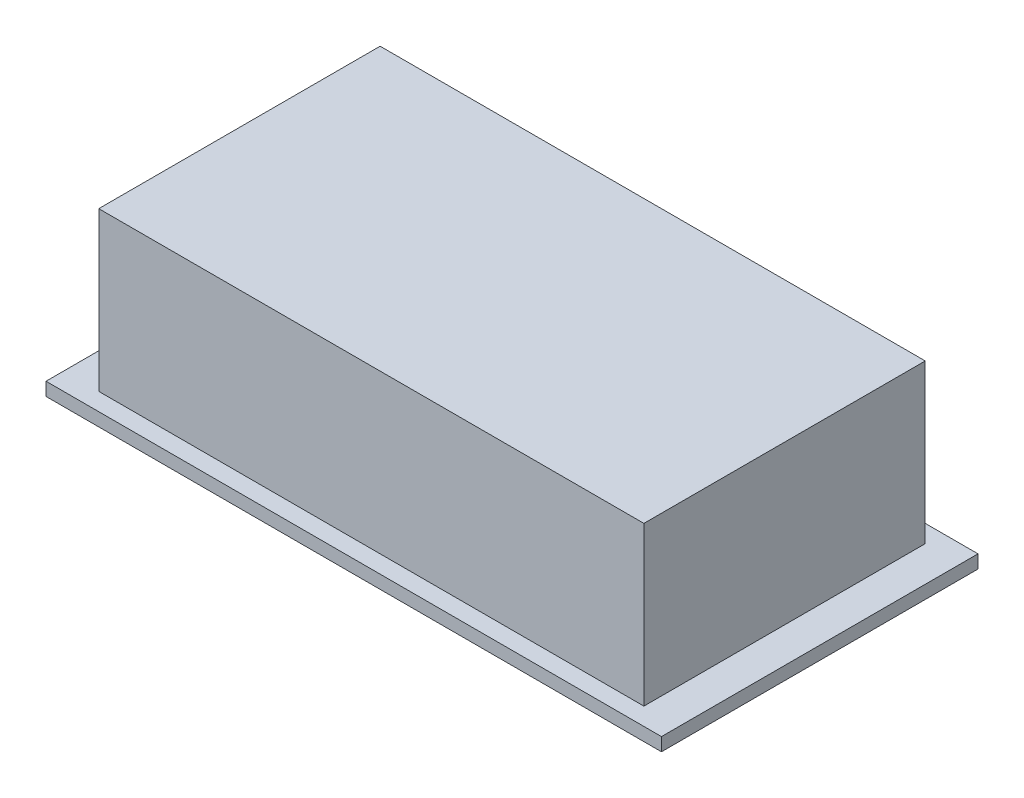
ISO-10303-21;
HEADER;
FILE_DESCRIPTION(('STEP AP214'),'2;1');
FILE_NAME('part.step','',(''),(''),'','','');
FILE_SCHEMA(('AUTOMOTIVE_DESIGN { 1 0 10303 214 1 1 1 1 }'));
ENDSEC;
DATA;
#1=APPLICATION_CONTEXT('core data for automotive mechanical design processes');
#2=APPLICATION_PROTOCOL_DEFINITION('international standard','automotive_design',2000,#1);
#3=PRODUCT_CONTEXT('',#1,'mechanical');
#4=PRODUCT('Part','Part','',(#3));
#5=PRODUCT_RELATED_PRODUCT_CATEGORY('part','',(#4));
#6=PRODUCT_DEFINITION_FORMATION('','',#4);
#7=PRODUCT_DEFINITION_CONTEXT('part definition',#1,'design');
#8=PRODUCT_DEFINITION('design','',#6,#7);
#9=PRODUCT_DEFINITION_SHAPE('','',#8);
#10=(LENGTH_UNIT() NAMED_UNIT(*) SI_UNIT(.MILLI.,.METRE.));
#11=(NAMED_UNIT(*) PLANE_ANGLE_UNIT() SI_UNIT($,.RADIAN.));
#12=(NAMED_UNIT(*) SI_UNIT($,.STERADIAN.) SOLID_ANGLE_UNIT());
#13=UNCERTAINTY_MEASURE_WITH_UNIT(LENGTH_MEASURE(1.E-05),#10,'distance_accuracy_value','');
#14=(GEOMETRIC_REPRESENTATION_CONTEXT(3) GLOBAL_UNCERTAINTY_ASSIGNED_CONTEXT((#13)) GLOBAL_UNIT_ASSIGNED_CONTEXT((#10,
#11,#12)) REPRESENTATION_CONTEXT('',''));
#15=CARTESIAN_POINT('',(0.,0.,0.));
#16=DIRECTION('',(0.,0.,1.));
#17=DIRECTION('',(1.,0.,0.));
#18=AXIS2_PLACEMENT_3D('',#15,#16,#17);
#19=CARTESIAN_POINT('',(0.,1.5,0.));
#20=DIRECTION('',(0.,-1.,0.));
#21=DIRECTION('',(0.,0.,-1.));
#22=AXIS2_PLACEMENT_3D('',#19,#20,#21);
#23=PLANE('',#22);
#24=DIRECTION('',(0.,0.,-1.));
#25=VECTOR('',#24,1.);
#26=CARTESIAN_POINT('',(35.,1.5,18.));
#27=LINE('',#26,#25);
#28=CARTESIAN_POINT('',(35.,1.5,18.));
#29=VERTEX_POINT('',#28);
#30=CARTESIAN_POINT('',(35.,1.5,-18.));
#31=VERTEX_POINT('',#30);
#32=EDGE_CURVE('E143',#29,#31,#27,.T.);
#33=ORIENTED_EDGE('',*,*,#32,.T.);
#34=DIRECTION('',(-1.,0.,0.));
#35=VECTOR('',#34,1.);
#36=CARTESIAN_POINT('',(-35.,1.5,-18.));
#37=LINE('',#36,#35);
#38=CARTESIAN_POINT('',(-35.,1.5,-18.));
#39=VERTEX_POINT('',#38);
#40=EDGE_CURVE('E147',#31,#39,#37,.T.);
#41=ORIENTED_EDGE('',*,*,#40,.T.);
#42=DIRECTION('',(0.,0.,1.));
#43=VECTOR('',#42,1.);
#44=CARTESIAN_POINT('',(-35.,1.5,18.));
#45=LINE('',#44,#43);
#46=CARTESIAN_POINT('',(-35.,1.5,18.));
#47=VERTEX_POINT('',#46);
#48=EDGE_CURVE('E151',#39,#47,#45,.T.);
#49=ORIENTED_EDGE('',*,*,#48,.T.);
#50=DIRECTION('',(1.,0.,0.));
#51=VECTOR('',#50,1.);
#52=CARTESIAN_POINT('',(-35.,1.5,18.));
#53=LINE('',#52,#51);
#54=EDGE_CURVE('E154',#47,#29,#53,.T.);
#55=ORIENTED_EDGE('',*,*,#54,.T.);
#56=EDGE_LOOP('',(#33,#41,#49,#55));
#57=FACE_BOUND('',#56,.T.);
#58=DIRECTION('',(0.,0.,-1.));
#59=VECTOR('',#58,1.);
#60=CARTESIAN_POINT('',(31.,1.5,16.));
#61=LINE('',#60,#59);
#62=CARTESIAN_POINT('',(31.,1.5,16.));
#63=VERTEX_POINT('',#62);
#64=CARTESIAN_POINT('',(31.,1.5,-16.));
#65=VERTEX_POINT('',#64);
#66=EDGE_CURVE('E59',#63,#65,#61,.T.);
#67=ORIENTED_EDGE('',*,*,#66,.F.);
#68=DIRECTION('',(1.,0.,0.));
#69=VECTOR('',#68,1.);
#70=CARTESIAN_POINT('',(-31.,1.5,16.));
#71=LINE('',#70,#69);
#72=CARTESIAN_POINT('',(-31.,1.5,16.));
#73=VERTEX_POINT('',#72);
#74=EDGE_CURVE('E63',#73,#63,#71,.T.);
#75=ORIENTED_EDGE('',*,*,#74,.F.);
#76=DIRECTION('',(0.,0.,1.));
#77=VECTOR('',#76,1.);
#78=CARTESIAN_POINT('',(-31.,1.5,16.));
#79=LINE('',#78,#77);
#80=CARTESIAN_POINT('',(-31.,1.5,-16.));
#81=VERTEX_POINT('',#80);
#82=EDGE_CURVE('E309',#81,#73,#79,.T.);
#83=ORIENTED_EDGE('',*,*,#82,.F.);
#84=DIRECTION('',(-1.,0.,0.));
#85=VECTOR('',#84,1.);
#86=CARTESIAN_POINT('',(-31.,1.5,-16.));
#87=LINE('',#86,#85);
#88=EDGE_CURVE('E319',#65,#81,#87,.T.);
#89=ORIENTED_EDGE('',*,*,#88,.F.);
#90=EDGE_LOOP('',(#67,#75,#83,#89));
#91=FACE_BOUND('',#90,.T.);
#92=ADVANCED_FACE('F43',(#57,#91),#23,.F.);
#93=CARTESIAN_POINT('',(35.,1.5,18.));
#94=DIRECTION('',(-1.,0.,0.));
#95=DIRECTION('',(0.,0.,1.));
#96=AXIS2_PLACEMENT_3D('',#93,#94,#95);
#97=PLANE('',#96);
#98=DIRECTION('',(0.,0.,-1.));
#99=VECTOR('',#98,1.);
#100=CARTESIAN_POINT('',(35.,0.,18.));
#101=LINE('',#100,#99);
#102=CARTESIAN_POINT('',(35.,0.,18.));
#103=VERTEX_POINT('',#102);
#104=CARTESIAN_POINT('',(35.,0.,-18.));
#105=VERTEX_POINT('',#104);
#106=EDGE_CURVE('E132',#103,#105,#101,.T.);
#107=ORIENTED_EDGE('',*,*,#106,.T.);
#108=DIRECTION('',(0.,-1.,0.));
#109=VECTOR('',#108,1.);
#110=CARTESIAN_POINT('',(35.,1.5,-18.));
#111=LINE('',#110,#109);
#112=EDGE_CURVE('E11',#31,#105,#111,.T.);
#113=ORIENTED_EDGE('',*,*,#112,.F.);
#114=ORIENTED_EDGE('',*,*,#32,.F.);
#115=DIRECTION('',(0.,-1.,0.));
#116=VECTOR('',#115,1.);
#117=CARTESIAN_POINT('',(35.,1.5,18.));
#118=LINE('',#117,#116);
#119=EDGE_CURVE('E156',#29,#103,#118,.T.);
#120=ORIENTED_EDGE('',*,*,#119,.T.);
#121=EDGE_LOOP('',(#107,#113,#114,#120));
#122=FACE_BOUND('',#121,.T.);
#123=ADVANCED_FACE('F45',(#122),#97,.F.);
#124=CARTESIAN_POINT('',(-35.,1.5,-18.));
#125=DIRECTION('',(0.,0.,1.));
#126=DIRECTION('',(1.,0.,0.));
#127=AXIS2_PLACEMENT_3D('',#124,#125,#126);
#128=PLANE('',#127);
#129=DIRECTION('',(-1.,0.,0.));
#130=VECTOR('',#129,1.);
#131=CARTESIAN_POINT('',(-35.,0.,-18.));
#132=LINE('',#131,#130);
#133=CARTESIAN_POINT('',(-35.,0.,-18.));
#134=VERTEX_POINT('',#133);
#135=EDGE_CURVE('E137',#105,#134,#132,.T.);
#136=ORIENTED_EDGE('',*,*,#135,.T.);
#137=DIRECTION('',(0.,-1.,0.));
#138=VECTOR('',#137,1.);
#139=CARTESIAN_POINT('',(-35.,1.5,-18.));
#140=LINE('',#139,#138);
#141=EDGE_CURVE('E52',#39,#134,#140,.T.);
#142=ORIENTED_EDGE('',*,*,#141,.F.);
#143=ORIENTED_EDGE('',*,*,#40,.F.);
#144=ORIENTED_EDGE('',*,*,#112,.T.);
#145=EDGE_LOOP('',(#136,#142,#143,#144));
#146=FACE_BOUND('',#145,.T.);
#147=ADVANCED_FACE('F192',(#146),#128,.F.);
#148=CARTESIAN_POINT('',(-35.,1.5,18.));
#149=DIRECTION('',(1.,0.,0.));
#150=DIRECTION('',(0.,0.,-1.));
#151=AXIS2_PLACEMENT_3D('',#148,#149,#150);
#152=PLANE('',#151);
#153=DIRECTION('',(0.,0.,1.));
#154=VECTOR('',#153,1.);
#155=CARTESIAN_POINT('',(-35.,0.,18.));
#156=LINE('',#155,#154);
#157=CARTESIAN_POINT('',(-35.,0.,18.));
#158=VERTEX_POINT('',#157);
#159=EDGE_CURVE('E160',#134,#158,#156,.T.);
#160=ORIENTED_EDGE('',*,*,#159,.T.);
#161=DIRECTION('',(0.,-1.,0.));
#162=VECTOR('',#161,1.);
#163=CARTESIAN_POINT('',(-35.,1.5,18.));
#164=LINE('',#163,#162);
#165=EDGE_CURVE('E168',#47,#158,#164,.T.);
#166=ORIENTED_EDGE('',*,*,#165,.F.);
#167=ORIENTED_EDGE('',*,*,#48,.F.);
#168=ORIENTED_EDGE('',*,*,#141,.T.);
#169=EDGE_LOOP('',(#160,#166,#167,#168));
#170=FACE_BOUND('',#169,.T.);
#171=ADVANCED_FACE('F177',(#170),#152,.F.);
#172=CARTESIAN_POINT('',(-35.,1.5,18.));
#173=DIRECTION('',(0.,0.,-1.));
#174=DIRECTION('',(-1.,0.,0.));
#175=AXIS2_PLACEMENT_3D('',#172,#173,#174);
#176=PLANE('',#175);
#177=DIRECTION('',(1.,0.,0.));
#178=VECTOR('',#177,1.);
#179=CARTESIAN_POINT('',(-35.,0.,18.));
#180=LINE('',#179,#178);
#181=EDGE_CURVE('E148',#158,#103,#180,.T.);
#182=ORIENTED_EDGE('',*,*,#181,.T.);
#183=ORIENTED_EDGE('',*,*,#119,.F.);
#184=ORIENTED_EDGE('',*,*,#54,.F.);
#185=ORIENTED_EDGE('',*,*,#165,.T.);
#186=EDGE_LOOP('',(#182,#183,#184,#185));
#187=FACE_BOUND('',#186,.T.);
#188=ADVANCED_FACE('F186',(#187),#176,.F.);
#189=CARTESIAN_POINT('',(0.,0.,0.));
#190=DIRECTION('',(0.,-1.,0.));
#191=DIRECTION('',(0.,0.,-1.));
#192=AXIS2_PLACEMENT_3D('',#189,#190,#191);
#193=PLANE('',#192);
#194=ORIENTED_EDGE('',*,*,#106,.F.);
#195=ORIENTED_EDGE('',*,*,#181,.F.);
#196=ORIENTED_EDGE('',*,*,#159,.F.);
#197=ORIENTED_EDGE('',*,*,#135,.F.);
#198=EDGE_LOOP('',(#194,#195,#196,#197));
#199=FACE_BOUND('',#198,.T.);
#200=ADVANCED_FACE('F183',(#199),#193,.T.);
#201=CARTESIAN_POINT('',(31.,19.5,16.));
#202=DIRECTION('',(-1.,0.,0.));
#203=DIRECTION('',(0.,0.,1.));
#204=AXIS2_PLACEMENT_3D('',#201,#202,#203);
#205=PLANE('',#204);
#206=ORIENTED_EDGE('',*,*,#66,.T.);
#207=DIRECTION('',(0.,-1.,0.));
#208=VECTOR('',#207,1.);
#209=CARTESIAN_POINT('',(31.,19.5,-16.));
#210=LINE('',#209,#208);
#211=CARTESIAN_POINT('',(31.,19.5,-16.));
#212=VERTEX_POINT('',#211);
#213=EDGE_CURVE('E112',#212,#65,#210,.T.);
#214=ORIENTED_EDGE('',*,*,#213,.F.);
#215=DIRECTION('',(0.,0.,-1.));
#216=VECTOR('',#215,1.);
#217=CARTESIAN_POINT('',(31.,19.5,16.));
#218=LINE('',#217,#216);
#219=CARTESIAN_POINT('',(31.,19.5,16.));
#220=VERTEX_POINT('',#219);
#221=EDGE_CURVE('E119',#220,#212,#218,.T.);
#222=ORIENTED_EDGE('',*,*,#221,.F.);
#223=DIRECTION('',(0.,-1.,0.));
#224=VECTOR('',#223,1.);
#225=CARTESIAN_POINT('',(31.,19.5,16.));
#226=LINE('',#225,#224);
#227=EDGE_CURVE('E306',#220,#63,#226,.T.);
#228=ORIENTED_EDGE('',*,*,#227,.T.);
#229=EDGE_LOOP('',(#206,#214,#222,#228));
#230=FACE_BOUND('',#229,.T.);
#231=ADVANCED_FACE('F130',(#230),#205,.F.);
#232=CARTESIAN_POINT('',(-31.,19.5,-16.));
#233=DIRECTION('',(0.,0.,1.));
#234=DIRECTION('',(1.,0.,0.));
#235=AXIS2_PLACEMENT_3D('',#232,#233,#234);
#236=PLANE('',#235);
#237=ORIENTED_EDGE('',*,*,#88,.T.);
#238=DIRECTION('',(0.,-1.,0.));
#239=VECTOR('',#238,1.);
#240=CARTESIAN_POINT('',(-31.,19.5,-16.));
#241=LINE('',#240,#239);
#242=CARTESIAN_POINT('',(-31.,19.5,-16.));
#243=VERTEX_POINT('',#242);
#244=EDGE_CURVE('E114',#243,#81,#241,.T.);
#245=ORIENTED_EDGE('',*,*,#244,.F.);
#246=DIRECTION('',(-1.,0.,0.));
#247=VECTOR('',#246,1.);
#248=CARTESIAN_POINT('',(-31.,19.5,-16.));
#249=LINE('',#248,#247);
#250=EDGE_CURVE('E107',#212,#243,#249,.T.);
#251=ORIENTED_EDGE('',*,*,#250,.F.);
#252=ORIENTED_EDGE('',*,*,#213,.T.);
#253=EDGE_LOOP('',(#237,#245,#251,#252));
#254=FACE_BOUND('',#253,.T.);
#255=ADVANCED_FACE('F110',(#254),#236,.F.);
#256=CARTESIAN_POINT('',(-31.,19.5,16.));
#257=DIRECTION('',(1.,0.,0.));
#258=DIRECTION('',(0.,0.,-1.));
#259=AXIS2_PLACEMENT_3D('',#256,#257,#258);
#260=PLANE('',#259);
#261=ORIENTED_EDGE('',*,*,#82,.T.);
#262=DIRECTION('',(0.,-1.,0.));
#263=VECTOR('',#262,1.);
#264=CARTESIAN_POINT('',(-31.,19.5,16.));
#265=LINE('',#264,#263);
#266=CARTESIAN_POINT('',(-31.,19.5,16.));
#267=VERTEX_POINT('',#266);
#268=EDGE_CURVE('E139',#267,#73,#265,.T.);
#269=ORIENTED_EDGE('',*,*,#268,.F.);
#270=DIRECTION('',(0.,0.,1.));
#271=VECTOR('',#270,1.);
#272=CARTESIAN_POINT('',(-31.,19.5,16.));
#273=LINE('',#272,#271);
#274=EDGE_CURVE('E118',#243,#267,#273,.T.);
#275=ORIENTED_EDGE('',*,*,#274,.F.);
#276=ORIENTED_EDGE('',*,*,#244,.T.);
#277=EDGE_LOOP('',(#261,#269,#275,#276));
#278=FACE_BOUND('',#277,.T.);
#279=ADVANCED_FACE('F228',(#278),#260,.F.);
#280=CARTESIAN_POINT('',(-31.,19.5,16.));
#281=DIRECTION('',(0.,0.,-1.));
#282=DIRECTION('',(-1.,0.,0.));
#283=AXIS2_PLACEMENT_3D('',#280,#281,#282);
#284=PLANE('',#283);
#285=ORIENTED_EDGE('',*,*,#74,.T.);
#286=ORIENTED_EDGE('',*,*,#227,.F.);
#287=DIRECTION('',(1.,0.,0.));
#288=VECTOR('',#287,1.);
#289=CARTESIAN_POINT('',(-31.,19.5,16.));
#290=LINE('',#289,#288);
#291=EDGE_CURVE('E124',#267,#220,#290,.T.);
#292=ORIENTED_EDGE('',*,*,#291,.F.);
#293=ORIENTED_EDGE('',*,*,#268,.T.);
#294=EDGE_LOOP('',(#285,#286,#292,#293));
#295=FACE_BOUND('',#294,.T.);
#296=ADVANCED_FACE('F234',(#295),#284,.F.);
#297=CARTESIAN_POINT('',(0.,19.5,0.));
#298=DIRECTION('',(0.,-1.,0.));
#299=DIRECTION('',(0.,0.,-1.));
#300=AXIS2_PLACEMENT_3D('',#297,#298,#299);
#301=PLANE('',#300);
#302=ORIENTED_EDGE('',*,*,#221,.T.);
#303=ORIENTED_EDGE('',*,*,#250,.T.);
#304=ORIENTED_EDGE('',*,*,#274,.T.);
#305=ORIENTED_EDGE('',*,*,#291,.T.);
#306=EDGE_LOOP('',(#302,#303,#304,#305));
#307=FACE_BOUND('',#306,.T.);
#308=ADVANCED_FACE('F122',(#307),#301,.F.);
#309=CLOSED_SHELL('',(#92,#123,#147,#171,#188,#200,#231,#255,#279,#296,#308));
#310=MANIFOLD_SOLID_BREP('B2',#309);
#311=ADVANCED_BREP_SHAPE_REPRESENTATION('',(#18,#310),#14);
#312=SHAPE_DEFINITION_REPRESENTATION(#9,#311);
ENDSEC;
END-ISO-10303-21;
